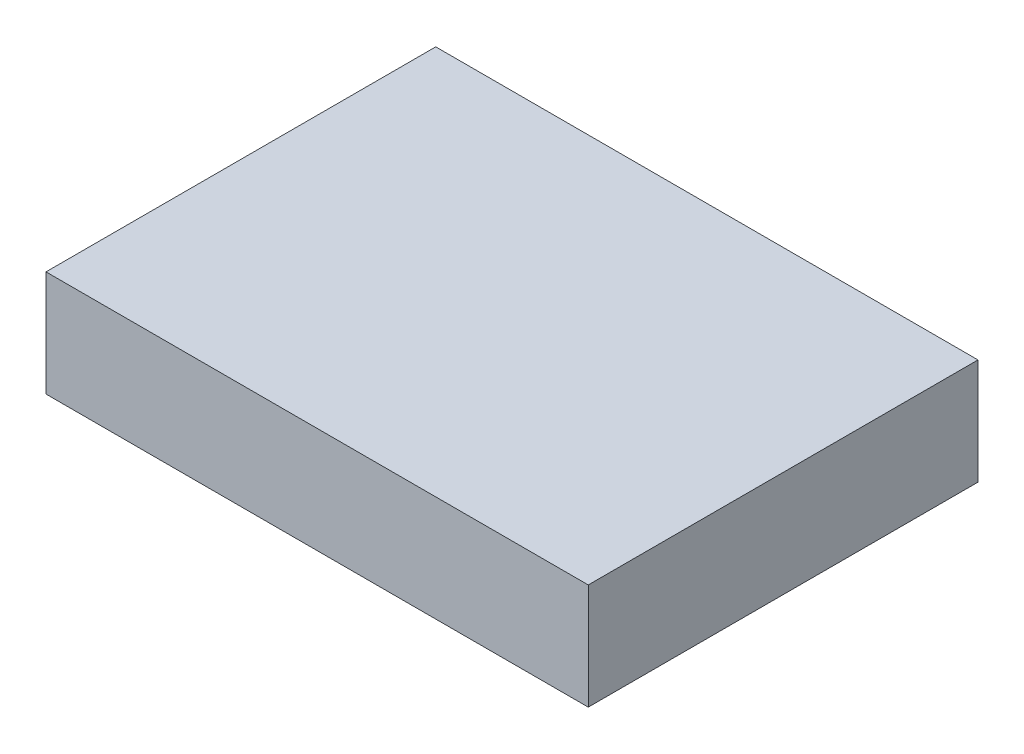
ISO-10303-21;
HEADER;
FILE_DESCRIPTION(('STEP AP214'),'2;1');
FILE_NAME('part.step','',(''),(''),'','','');
FILE_SCHEMA(('AUTOMOTIVE_DESIGN { 1 0 10303 214 1 1 1 1 }'));
ENDSEC;
DATA;
#1=APPLICATION_CONTEXT('core data for automotive mechanical design processes');
#2=APPLICATION_PROTOCOL_DEFINITION('international standard','automotive_design',2000,#1);
#3=PRODUCT_CONTEXT('',#1,'mechanical');
#4=PRODUCT('Part','Part','',(#3));
#5=PRODUCT_RELATED_PRODUCT_CATEGORY('part','',(#4));
#6=PRODUCT_DEFINITION_FORMATION('','',#4);
#7=PRODUCT_DEFINITION_CONTEXT('part definition',#1,'design');
#8=PRODUCT_DEFINITION('design','',#6,#7);
#9=PRODUCT_DEFINITION_SHAPE('','',#8);
#10=(LENGTH_UNIT() NAMED_UNIT(*) SI_UNIT(.MILLI.,.METRE.));
#11=(NAMED_UNIT(*) PLANE_ANGLE_UNIT() SI_UNIT($,.RADIAN.));
#12=(NAMED_UNIT(*) SI_UNIT($,.STERADIAN.) SOLID_ANGLE_UNIT());
#13=UNCERTAINTY_MEASURE_WITH_UNIT(LENGTH_MEASURE(1.E-05),#10,'distance_accuracy_value','');
#14=(GEOMETRIC_REPRESENTATION_CONTEXT(3) GLOBAL_UNCERTAINTY_ASSIGNED_CONTEXT((#13)) GLOBAL_UNIT_ASSIGNED_CONTEXT((#10,
#11,#12)) REPRESENTATION_CONTEXT('',''));
#15=CARTESIAN_POINT('',(0.,0.,0.));
#16=DIRECTION('',(0.,0.,1.));
#17=DIRECTION('',(1.,0.,0.));
#18=AXIS2_PLACEMENT_3D('',#15,#16,#17);
#19=CARTESIAN_POINT('',(56.35,22.,40.5));
#20=DIRECTION('',(-1.,0.,0.));
#21=DIRECTION('',(0.,0.,1.));
#22=AXIS2_PLACEMENT_3D('',#19,#20,#21);
#23=PLANE('',#22);
#24=DIRECTION('',(0.,0.,-1.));
#25=VECTOR('',#24,1.);
#26=CARTESIAN_POINT('',(56.35,0.,40.5));
#27=LINE('',#26,#25);
#28=CARTESIAN_POINT('',(56.35,0.,40.5));
#29=VERTEX_POINT('',#28);
#30=CARTESIAN_POINT('',(56.35,0.,-40.5));
#31=VERTEX_POINT('',#30);
#32=EDGE_CURVE('E98',#29,#31,#27,.T.);
#33=ORIENTED_EDGE('',*,*,#32,.T.);
#34=DIRECTION('',(0.,-1.,0.));
#35=VECTOR('',#34,1.);
#36=CARTESIAN_POINT('',(56.35,22.,-40.5));
#37=LINE('',#36,#35);
#38=CARTESIAN_POINT('',(56.35,22.,-40.5));
#39=VERTEX_POINT('',#38);
#40=EDGE_CURVE('E11',#39,#31,#37,.T.);
#41=ORIENTED_EDGE('',*,*,#40,.F.);
#42=DIRECTION('',(0.,0.,-1.));
#43=VECTOR('',#42,1.);
#44=CARTESIAN_POINT('',(56.35,22.,40.5));
#45=LINE('',#44,#43);
#46=CARTESIAN_POINT('',(56.35,22.,40.5));
#47=VERTEX_POINT('',#46);
#48=EDGE_CURVE('E86',#47,#39,#45,.T.);
#49=ORIENTED_EDGE('',*,*,#48,.F.);
#50=DIRECTION('',(0.,-1.,0.));
#51=VECTOR('',#50,1.);
#52=CARTESIAN_POINT('',(56.35,22.,40.5));
#53=LINE('',#52,#51);
#54=EDGE_CURVE('E94',#47,#29,#53,.T.);
#55=ORIENTED_EDGE('',*,*,#54,.T.);
#56=EDGE_LOOP('',(#33,#41,#49,#55));
#57=FACE_BOUND('',#56,.T.);
#58=ADVANCED_FACE('F35',(#57),#23,.F.);
#59=CARTESIAN_POINT('',(-56.35,22.,-40.5));
#60=DIRECTION('',(0.,0.,1.));
#61=DIRECTION('',(1.,0.,0.));
#62=AXIS2_PLACEMENT_3D('',#59,#60,#61);
#63=PLANE('',#62);
#64=DIRECTION('',(-1.,0.,0.));
#65=VECTOR('',#64,1.);
#66=CARTESIAN_POINT('',(-56.35,0.,-40.5));
#67=LINE('',#66,#65);
#68=CARTESIAN_POINT('',(-56.35,0.,-40.5));
#69=VERTEX_POINT('',#68);
#70=EDGE_CURVE('E90',#31,#69,#67,.T.);
#71=ORIENTED_EDGE('',*,*,#70,.T.);
#72=DIRECTION('',(0.,-1.,0.));
#73=VECTOR('',#72,1.);
#74=CARTESIAN_POINT('',(-56.35,22.,-40.5));
#75=LINE('',#74,#73);
#76=CARTESIAN_POINT('',(-56.35,22.,-40.5));
#77=VERTEX_POINT('',#76);
#78=EDGE_CURVE('E43',#77,#69,#75,.T.);
#79=ORIENTED_EDGE('',*,*,#78,.F.);
#80=DIRECTION('',(-1.,0.,0.));
#81=VECTOR('',#80,1.);
#82=CARTESIAN_POINT('',(-56.35,22.,-40.5));
#83=LINE('',#82,#81);
#84=EDGE_CURVE('E81',#39,#77,#83,.T.);
#85=ORIENTED_EDGE('',*,*,#84,.F.);
#86=ORIENTED_EDGE('',*,*,#40,.T.);
#87=EDGE_LOOP('',(#71,#79,#85,#86));
#88=FACE_BOUND('',#87,.T.);
#89=ADVANCED_FACE('F89',(#88),#63,.F.);
#90=CARTESIAN_POINT('',(-56.35,22.,40.5));
#91=DIRECTION('',(1.,0.,0.));
#92=DIRECTION('',(0.,0.,-1.));
#93=AXIS2_PLACEMENT_3D('',#90,#91,#92);
#94=PLANE('',#93);
#95=DIRECTION('',(0.,0.,1.));
#96=VECTOR('',#95,1.);
#97=CARTESIAN_POINT('',(-56.35,0.,40.5));
#98=LINE('',#97,#96);
#99=CARTESIAN_POINT('',(-56.35,0.,40.5));
#100=VERTEX_POINT('',#99);
#101=EDGE_CURVE('E68',#69,#100,#98,.T.);
#102=ORIENTED_EDGE('',*,*,#101,.T.);
#103=DIRECTION('',(0.,-1.,0.));
#104=VECTOR('',#103,1.);
#105=CARTESIAN_POINT('',(-56.35,22.,40.5));
#106=LINE('',#105,#104);
#107=CARTESIAN_POINT('',(-56.35,22.,40.5));
#108=VERTEX_POINT('',#107);
#109=EDGE_CURVE('E91',#108,#100,#106,.T.);
#110=ORIENTED_EDGE('',*,*,#109,.F.);
#111=DIRECTION('',(0.,0.,1.));
#112=VECTOR('',#111,1.);
#113=CARTESIAN_POINT('',(-56.35,22.,40.5));
#114=LINE('',#113,#112);
#115=EDGE_CURVE('E84',#77,#108,#114,.T.);
#116=ORIENTED_EDGE('',*,*,#115,.F.);
#117=ORIENTED_EDGE('',*,*,#78,.T.);
#118=EDGE_LOOP('',(#102,#110,#116,#117));
#119=FACE_BOUND('',#118,.T.);
#120=ADVANCED_FACE('F92',(#119),#94,.F.);
#121=CARTESIAN_POINT('',(-56.35,22.,40.5));
#122=DIRECTION('',(0.,0.,-1.));
#123=DIRECTION('',(-1.,0.,0.));
#124=AXIS2_PLACEMENT_3D('',#121,#122,#123);
#125=PLANE('',#124);
#126=DIRECTION('',(1.,0.,0.));
#127=VECTOR('',#126,1.);
#128=CARTESIAN_POINT('',(-56.35,0.,40.5));
#129=LINE('',#128,#127);
#130=EDGE_CURVE('E74',#100,#29,#129,.T.);
#131=ORIENTED_EDGE('',*,*,#130,.T.);
#132=ORIENTED_EDGE('',*,*,#54,.F.);
#133=DIRECTION('',(1.,0.,0.));
#134=VECTOR('',#133,1.);
#135=CARTESIAN_POINT('',(-56.35,22.,40.5));
#136=LINE('',#135,#134);
#137=EDGE_CURVE('E51',#108,#47,#136,.T.);
#138=ORIENTED_EDGE('',*,*,#137,.F.);
#139=ORIENTED_EDGE('',*,*,#109,.T.);
#140=EDGE_LOOP('',(#131,#132,#138,#139));
#141=FACE_BOUND('',#140,.T.);
#142=ADVANCED_FACE('F105',(#141),#125,.F.);
#143=CARTESIAN_POINT('',(0.,22.,0.));
#144=DIRECTION('',(0.,-1.,0.));
#145=DIRECTION('',(0.,0.,-1.));
#146=AXIS2_PLACEMENT_3D('',#143,#144,#145);
#147=PLANE('',#146);
#148=ORIENTED_EDGE('',*,*,#48,.T.);
#149=ORIENTED_EDGE('',*,*,#84,.T.);
#150=ORIENTED_EDGE('',*,*,#115,.T.);
#151=ORIENTED_EDGE('',*,*,#137,.T.);
#152=EDGE_LOOP('',(#148,#149,#150,#151));
#153=FACE_BOUND('',#152,.T.);
#154=ADVANCED_FACE('F82',(#153),#147,.F.);
#155=CARTESIAN_POINT('',(0.,0.,0.));
#156=DIRECTION('',(0.,-1.,0.));
#157=DIRECTION('',(0.,0.,-1.));
#158=AXIS2_PLACEMENT_3D('',#155,#156,#157);
#159=PLANE('',#158);
#160=ORIENTED_EDGE('',*,*,#32,.F.);
#161=ORIENTED_EDGE('',*,*,#130,.F.);
#162=ORIENTED_EDGE('',*,*,#101,.F.);
#163=ORIENTED_EDGE('',*,*,#70,.F.);
#164=EDGE_LOOP('',(#160,#161,#162,#163));
#165=FACE_BOUND('',#164,.T.);
#166=ADVANCED_FACE('F108',(#165),#159,.T.);
#167=CLOSED_SHELL('',(#58,#89,#120,#142,#154,#166));
#168=MANIFOLD_SOLID_BREP('B2',#167);
#169=ADVANCED_BREP_SHAPE_REPRESENTATION('',(#18,#168),#14);
#170=SHAPE_DEFINITION_REPRESENTATION(#9,#169);
ENDSEC;
END-ISO-10303-21;
